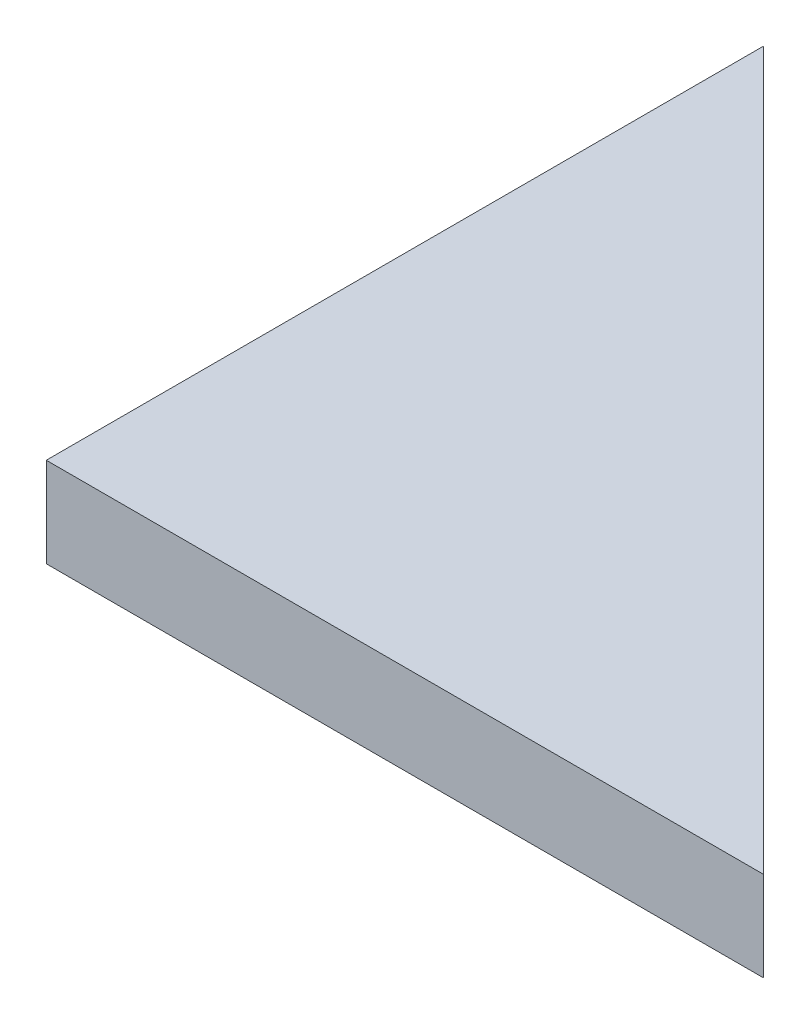
ISO-10303-21;
HEADER;
FILE_DESCRIPTION(('STEP AP214'),'2;1');
FILE_NAME('part.step','',(''),(''),'','','');
FILE_SCHEMA(('AUTOMOTIVE_DESIGN { 1 0 10303 214 1 1 1 1 }'));
ENDSEC;
DATA;
#1=APPLICATION_CONTEXT('core data for automotive mechanical design processes');
#2=APPLICATION_PROTOCOL_DEFINITION('international standard','automotive_design',2000,#1);
#3=PRODUCT_CONTEXT('',#1,'mechanical');
#4=PRODUCT('Part','Part','',(#3));
#5=PRODUCT_RELATED_PRODUCT_CATEGORY('part','',(#4));
#6=PRODUCT_DEFINITION_FORMATION('','',#4);
#7=PRODUCT_DEFINITION_CONTEXT('part definition',#1,'design');
#8=PRODUCT_DEFINITION('design','',#6,#7);
#9=PRODUCT_DEFINITION_SHAPE('','',#8);
#10=(LENGTH_UNIT() NAMED_UNIT(*) SI_UNIT(.MILLI.,.METRE.));
#11=(NAMED_UNIT(*) PLANE_ANGLE_UNIT() SI_UNIT($,.RADIAN.));
#12=(NAMED_UNIT(*) SI_UNIT($,.STERADIAN.) SOLID_ANGLE_UNIT());
#13=UNCERTAINTY_MEASURE_WITH_UNIT(LENGTH_MEASURE(1.E-05),#10,'distance_accuracy_value','');
#14=(GEOMETRIC_REPRESENTATION_CONTEXT(3) GLOBAL_UNCERTAINTY_ASSIGNED_CONTEXT((#13)) GLOBAL_UNIT_ASSIGNED_CONTEXT((#10,
#11,#12)) REPRESENTATION_CONTEXT('',''));
#15=CARTESIAN_POINT('',(0.,0.,0.));
#16=DIRECTION('',(0.,0.,1.));
#17=DIRECTION('',(1.,0.,0.));
#18=AXIS2_PLACEMENT_3D('',#15,#16,#17);
#19=CARTESIAN_POINT('',(0.8,0.1,0.));
#20=DIRECTION('',(0.,0.,-1.));
#21=DIRECTION('',(-1.,0.,0.));
#22=AXIS2_PLACEMENT_3D('',#19,#20,#21);
#23=PLANE('',#22);
#24=DIRECTION('',(1.,0.,0.));
#25=VECTOR('',#24,1.);
#26=CARTESIAN_POINT('',(0.8,0.,0.));
#27=LINE('',#26,#25);
#28=CARTESIAN_POINT('',(0.,0.,0.));
#29=VERTEX_POINT('',#28);
#30=CARTESIAN_POINT('',(0.8,0.,0.));
#31=VERTEX_POINT('',#30);
#32=EDGE_CURVE('E89',#29,#31,#27,.T.);
#33=ORIENTED_EDGE('',*,*,#32,.T.);
#34=DIRECTION('',(0.,-1.,0.));
#35=VECTOR('',#34,1.);
#36=CARTESIAN_POINT('',(0.8,0.1,0.));
#37=LINE('',#36,#35);
#38=CARTESIAN_POINT('',(0.8,0.1,0.));
#39=VERTEX_POINT('',#38);
#40=EDGE_CURVE('E11',#39,#31,#37,.T.);
#41=ORIENTED_EDGE('',*,*,#40,.F.);
#42=DIRECTION('',(1.,0.,0.));
#43=VECTOR('',#42,1.);
#44=CARTESIAN_POINT('',(0.8,0.1,0.));
#45=LINE('',#44,#43);
#46=CARTESIAN_POINT('',(0.,0.1,0.));
#47=VERTEX_POINT('',#46);
#48=EDGE_CURVE('E81',#47,#39,#45,.T.);
#49=ORIENTED_EDGE('',*,*,#48,.F.);
#50=DIRECTION('',(0.,-1.,0.));
#51=VECTOR('',#50,1.);
#52=CARTESIAN_POINT('',(0.,0.1,0.));
#53=LINE('',#52,#51);
#54=EDGE_CURVE('E90',#47,#29,#53,.T.);
#55=ORIENTED_EDGE('',*,*,#54,.T.);
#56=EDGE_LOOP('',(#33,#41,#49,#55));
#57=FACE_BOUND('',#56,.T.);
#58=ADVANCED_FACE('F39',(#57),#23,.F.);
#59=CARTESIAN_POINT('',(0.,0.1,-0.8));
#60=DIRECTION('',(-0.707106781186548,0.,0.707106781186548));
#61=DIRECTION('',(0.707106781186548,0.,0.707106781186548));
#62=AXIS2_PLACEMENT_3D('',#59,#60,#61);
#63=PLANE('',#62);
#64=DIRECTION('',(-0.707106781186548,0.,-0.707106781186548));
#65=VECTOR('',#64,1.);
#66=CARTESIAN_POINT('',(0.,0.,-0.8));
#67=LINE('',#66,#65);
#68=CARTESIAN_POINT('',(0.,0.,-0.8));
#69=VERTEX_POINT('',#68);
#70=EDGE_CURVE('E68',#31,#69,#67,.T.);
#71=ORIENTED_EDGE('',*,*,#70,.T.);
#72=DIRECTION('',(0.,-1.,0.));
#73=VECTOR('',#72,1.);
#74=CARTESIAN_POINT('',(0.,0.1,-0.8));
#75=LINE('',#74,#73);
#76=CARTESIAN_POINT('',(0.,0.1,-0.8));
#77=VERTEX_POINT('',#76);
#78=EDGE_CURVE('E48',#77,#69,#75,.T.);
#79=ORIENTED_EDGE('',*,*,#78,.F.);
#80=DIRECTION('',(-0.707106781186548,0.,-0.707106781186548));
#81=VECTOR('',#80,1.);
#82=CARTESIAN_POINT('',(0.,0.1,-0.8));
#83=LINE('',#82,#81);
#84=EDGE_CURVE('E76',#39,#77,#83,.T.);
#85=ORIENTED_EDGE('',*,*,#84,.F.);
#86=ORIENTED_EDGE('',*,*,#40,.T.);
#87=EDGE_LOOP('',(#71,#79,#85,#86));
#88=FACE_BOUND('',#87,.T.);
#89=ADVANCED_FACE('F77',(#88),#63,.F.);
#90=CARTESIAN_POINT('',(0.,0.1,0.));
#91=DIRECTION('',(1.,0.,0.));
#92=DIRECTION('',(0.,0.,-1.));
#93=AXIS2_PLACEMENT_3D('',#90,#91,#92);
#94=PLANE('',#93);
#95=DIRECTION('',(0.,0.,1.));
#96=VECTOR('',#95,1.);
#97=CARTESIAN_POINT('',(0.,0.,0.));
#98=LINE('',#97,#96);
#99=EDGE_CURVE('E73',#69,#29,#98,.T.);
#100=ORIENTED_EDGE('',*,*,#99,.T.);
#101=ORIENTED_EDGE('',*,*,#54,.F.);
#102=DIRECTION('',(0.,0.,1.));
#103=VECTOR('',#102,1.);
#104=CARTESIAN_POINT('',(0.,0.1,0.));
#105=LINE('',#104,#103);
#106=EDGE_CURVE('E56',#77,#47,#105,.T.);
#107=ORIENTED_EDGE('',*,*,#106,.F.);
#108=ORIENTED_EDGE('',*,*,#78,.T.);
#109=EDGE_LOOP('',(#100,#101,#107,#108));
#110=FACE_BOUND('',#109,.T.);
#111=ADVANCED_FACE('F102',(#110),#94,.F.);
#112=CARTESIAN_POINT('',(0.,0.1,0.));
#113=DIRECTION('',(0.,-1.,0.));
#114=DIRECTION('',(0.,0.,-1.));
#115=AXIS2_PLACEMENT_3D('',#112,#113,#114);
#116=PLANE('',#115);
#117=ORIENTED_EDGE('',*,*,#48,.T.);
#118=ORIENTED_EDGE('',*,*,#84,.T.);
#119=ORIENTED_EDGE('',*,*,#106,.T.);
#120=EDGE_LOOP('',(#117,#118,#119));
#121=FACE_BOUND('',#120,.T.);
#122=ADVANCED_FACE('F84',(#121),#116,.F.);
#123=CARTESIAN_POINT('',(0.,0.,0.));
#124=DIRECTION('',(0.,-1.,0.));
#125=DIRECTION('',(0.,0.,-1.));
#126=AXIS2_PLACEMENT_3D('',#123,#124,#125);
#127=PLANE('',#126);
#128=ORIENTED_EDGE('',*,*,#32,.F.);
#129=ORIENTED_EDGE('',*,*,#99,.F.);
#130=ORIENTED_EDGE('',*,*,#70,.F.);
#131=EDGE_LOOP('',(#128,#129,#130));
#132=FACE_BOUND('',#131,.T.);
#133=ADVANCED_FACE('F103',(#132),#127,.T.);
#134=CLOSED_SHELL('',(#58,#89,#111,#122,#133));
#135=MANIFOLD_SOLID_BREP('B2',#134);
#136=ADVANCED_BREP_SHAPE_REPRESENTATION('',(#18,#135),#14);
#137=SHAPE_DEFINITION_REPRESENTATION(#9,#136);
ENDSEC;
END-ISO-10303-21;
